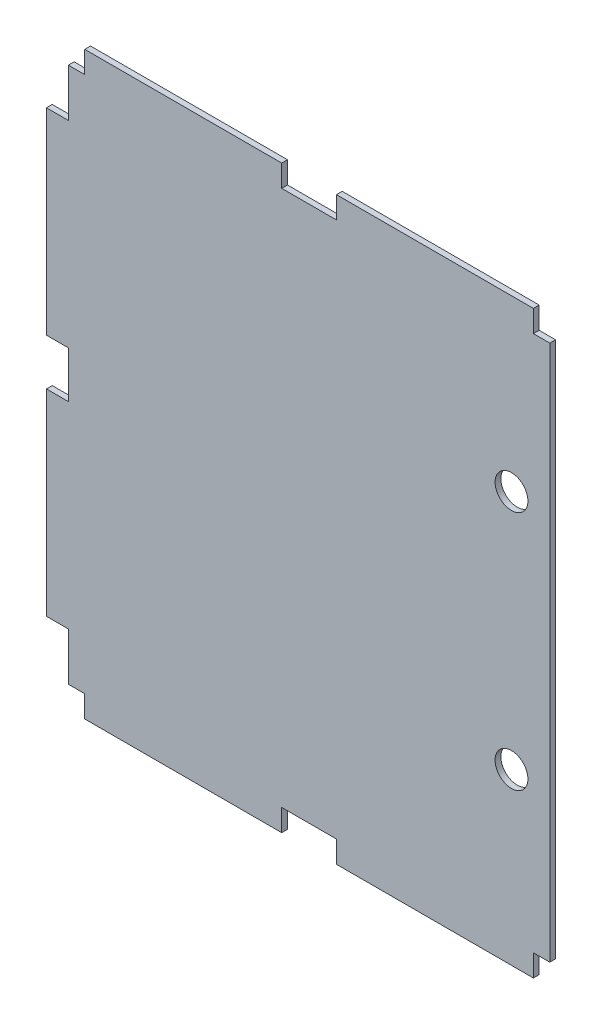
ISO-10303-21;
HEADER;
FILE_DESCRIPTION(('STEP AP214'),'2;1');
FILE_NAME('part.step','',(''),(''),'','','');
FILE_SCHEMA(('AUTOMOTIVE_DESIGN { 1 0 10303 214 1 1 1 1 }'));
ENDSEC;
DATA;
#1=APPLICATION_CONTEXT('core data for automotive mechanical design processes');
#2=APPLICATION_PROTOCOL_DEFINITION('international standard','automotive_design',2000,#1);
#3=PRODUCT_CONTEXT('',#1,'mechanical');
#4=PRODUCT('Part','Part','',(#3));
#5=PRODUCT_RELATED_PRODUCT_CATEGORY('part','',(#4));
#6=PRODUCT_DEFINITION_FORMATION('','',#4);
#7=PRODUCT_DEFINITION_CONTEXT('part definition',#1,'design');
#8=PRODUCT_DEFINITION('design','',#6,#7);
#9=PRODUCT_DEFINITION_SHAPE('','',#8);
#10=(LENGTH_UNIT() NAMED_UNIT(*) SI_UNIT(.MILLI.,.METRE.));
#11=(NAMED_UNIT(*) PLANE_ANGLE_UNIT() SI_UNIT($,.RADIAN.));
#12=(NAMED_UNIT(*) SI_UNIT($,.STERADIAN.) SOLID_ANGLE_UNIT());
#13=UNCERTAINTY_MEASURE_WITH_UNIT(LENGTH_MEASURE(1.E-05),#10,'distance_accuracy_value','');
#14=(GEOMETRIC_REPRESENTATION_CONTEXT(3) GLOBAL_UNCERTAINTY_ASSIGNED_CONTEXT((#13)) GLOBAL_UNIT_ASSIGNED_CONTEXT((#10,
#11,#12)) REPRESENTATION_CONTEXT('',''));
#15=CARTESIAN_POINT('',(0.,0.,0.));
#16=DIRECTION('',(0.,0.,1.));
#17=DIRECTION('',(1.,0.,0.));
#18=AXIS2_PLACEMENT_3D('',#15,#16,#17);
#19=CARTESIAN_POINT('',(0.,0.,0.));
#20=DIRECTION('',(0.,0.,1.));
#21=DIRECTION('',(1.,0.,0.));
#22=AXIS2_PLACEMENT_3D('',#19,#20,#21);
#23=PLANE('',#22);
#24=DIRECTION('',(1.,0.,0.));
#25=VECTOR('',#24,1.);
#26=CARTESIAN_POINT('',(0.,-155.575,0.));
#27=LINE('',#26,#25);
#28=CARTESIAN_POINT('',(-139.7,-155.575,0.));
#29=VERTEX_POINT('',#28);
#30=CARTESIAN_POINT('',(-130.175,-155.575,0.));
#31=VERTEX_POINT('',#30);
#32=EDGE_CURVE('E135',#29,#31,#27,.T.);
#33=ORIENTED_EDGE('',*,*,#32,.F.);
#34=DIRECTION('',(0.,1.,0.));
#35=VECTOR('',#34,1.);
#36=CARTESIAN_POINT('',(-139.7,0.,0.));
#37=LINE('',#36,#35);
#38=CARTESIAN_POINT('',(-139.7,-127.79375,0.));
#39=VERTEX_POINT('',#38);
#40=EDGE_CURVE('E296',#29,#39,#37,.T.);
#41=ORIENTED_EDGE('',*,*,#40,.T.);
#42=DIRECTION('',(-1.,0.,0.));
#43=VECTOR('',#42,1.);
#44=CARTESIAN_POINT('',(2.79290479632265E-13,-127.79375,0.));
#45=LINE('',#44,#43);
#46=CARTESIAN_POINT('',(-152.4,-127.79375,0.));
#47=VERTEX_POINT('',#46);
#48=EDGE_CURVE('E346',#39,#47,#45,.T.);
#49=ORIENTED_EDGE('',*,*,#48,.T.);
#50=DIRECTION('',(0.,-1.,0.));
#51=VECTOR('',#50,1.);
#52=CARTESIAN_POINT('',(-152.4,0.,0.));
#53=LINE('',#52,#51);
#54=CARTESIAN_POINT('',(-152.4,-13.49375,0.));
#55=VERTEX_POINT('',#54);
#56=EDGE_CURVE('E353',#55,#47,#53,.T.);
#57=ORIENTED_EDGE('',*,*,#56,.F.);
#58=DIRECTION('',(-1.,0.,0.));
#59=VECTOR('',#58,1.);
#60=CARTESIAN_POINT('',(0.,-13.49375,0.));
#61=LINE('',#60,#59);
#62=CARTESIAN_POINT('',(-139.7,-13.49375,0.));
#63=VERTEX_POINT('',#62);
#64=EDGE_CURVE('E348',#63,#55,#61,.T.);
#65=ORIENTED_EDGE('',*,*,#64,.F.);
#66=CARTESIAN_POINT('',(-139.7,13.49375,0.));
#67=VERTEX_POINT('',#66);
#68=EDGE_CURVE('E340',#63,#67,#37,.T.);
#69=ORIENTED_EDGE('',*,*,#68,.T.);
#70=DIRECTION('',(-1.,0.,0.));
#71=VECTOR('',#70,1.);
#72=CARTESIAN_POINT('',(0.,13.49375,0.));
#73=LINE('',#72,#71);
#74=CARTESIAN_POINT('',(-152.4,13.49375,0.));
#75=VERTEX_POINT('',#74);
#76=EDGE_CURVE('E349',#67,#75,#73,.T.);
#77=ORIENTED_EDGE('',*,*,#76,.T.);
#78=DIRECTION('',(0.,-1.,0.));
#79=VECTOR('',#78,1.);
#80=CARTESIAN_POINT('',(-152.4,0.,0.));
#81=LINE('',#80,#79);
#82=CARTESIAN_POINT('',(-152.4,127.79375,0.));
#83=VERTEX_POINT('',#82);
#84=EDGE_CURVE('E343',#83,#75,#81,.T.);
#85=ORIENTED_EDGE('',*,*,#84,.F.);
#86=DIRECTION('',(-1.,0.,0.));
#87=VECTOR('',#86,1.);
#88=CARTESIAN_POINT('',(0.,127.79375,0.));
#89=LINE('',#88,#87);
#90=CARTESIAN_POINT('',(-139.7,127.79375,0.));
#91=VERTEX_POINT('',#90);
#92=EDGE_CURVE('E339',#91,#83,#89,.T.);
#93=ORIENTED_EDGE('',*,*,#92,.F.);
#94=CARTESIAN_POINT('',(-139.7,155.575,0.));
#95=VERTEX_POINT('',#94);
#96=EDGE_CURVE('E336',#91,#95,#37,.T.);
#97=ORIENTED_EDGE('',*,*,#96,.T.);
#98=DIRECTION('',(1.,0.,0.));
#99=VECTOR('',#98,1.);
#100=CARTESIAN_POINT('',(0.,155.575,0.));
#101=LINE('',#100,#99);
#102=CARTESIAN_POINT('',(-130.175,155.575,0.));
#103=VERTEX_POINT('',#102);
#104=EDGE_CURVE('E332',#95,#103,#101,.T.);
#105=ORIENTED_EDGE('',*,*,#104,.T.);
#106=DIRECTION('',(0.,1.,0.));
#107=VECTOR('',#106,1.);
#108=CARTESIAN_POINT('',(-130.175,155.575,0.));
#109=LINE('',#108,#107);
#110=CARTESIAN_POINT('',(-130.175,168.275,0.));
#111=VERTEX_POINT('',#110);
#112=EDGE_CURVE('E113',#103,#111,#109,.T.);
#113=ORIENTED_EDGE('',*,*,#112,.T.);
#114=DIRECTION('',(1.,0.,0.));
#115=VECTOR('',#114,1.);
#116=CARTESIAN_POINT('',(-130.175,168.275,0.));
#117=LINE('',#116,#115);
#118=CARTESIAN_POINT('',(-15.875,168.275,0.));
#119=VERTEX_POINT('',#118);
#120=EDGE_CURVE('E91',#111,#119,#117,.T.);
#121=ORIENTED_EDGE('',*,*,#120,.T.);
#122=DIRECTION('',(0.,1.,0.));
#123=VECTOR('',#122,1.);
#124=CARTESIAN_POINT('',(-15.875,155.575,0.));
#125=LINE('',#124,#123);
#126=CARTESIAN_POINT('',(-15.875,155.575,0.));
#127=VERTEX_POINT('',#126);
#128=EDGE_CURVE('E100',#127,#119,#125,.T.);
#129=ORIENTED_EDGE('',*,*,#128,.F.);
#130=CARTESIAN_POINT('',(15.8750000000002,155.575,0.));
#131=VERTEX_POINT('',#130);
#132=EDGE_CURVE('E329',#127,#131,#101,.T.);
#133=ORIENTED_EDGE('',*,*,#132,.T.);
#134=DIRECTION('',(0.,1.,0.));
#135=VECTOR('',#134,1.);
#136=CARTESIAN_POINT('',(15.8750000000002,155.575,0.));
#137=LINE('',#136,#135);
#138=CARTESIAN_POINT('',(15.8750000000002,168.275,0.));
#139=VERTEX_POINT('',#138);
#140=EDGE_CURVE('E97',#131,#139,#137,.T.);
#141=ORIENTED_EDGE('',*,*,#140,.T.);
#142=DIRECTION('',(1.,0.,0.));
#143=VECTOR('',#142,1.);
#144=CARTESIAN_POINT('',(15.8750000000002,168.275,0.));
#145=LINE('',#144,#143);
#146=CARTESIAN_POINT('',(130.175,168.275,0.));
#147=VERTEX_POINT('',#146);
#148=EDGE_CURVE('E314',#139,#147,#145,.T.);
#149=ORIENTED_EDGE('',*,*,#148,.T.);
#150=DIRECTION('',(0.,1.,0.));
#151=VECTOR('',#150,1.);
#152=CARTESIAN_POINT('',(130.175,155.575,0.));
#153=LINE('',#152,#151);
#154=CARTESIAN_POINT('',(130.175,155.575,0.));
#155=VERTEX_POINT('',#154);
#156=EDGE_CURVE('E130',#155,#147,#153,.T.);
#157=ORIENTED_EDGE('',*,*,#156,.F.);
#158=CARTESIAN_POINT('',(139.7,155.575,0.));
#159=VERTEX_POINT('',#158);
#160=EDGE_CURVE('E323',#155,#159,#101,.T.);
#161=ORIENTED_EDGE('',*,*,#160,.T.);
#162=DIRECTION('',(0.,1.,0.));
#163=VECTOR('',#162,1.);
#164=CARTESIAN_POINT('',(139.7,0.,0.));
#165=LINE('',#164,#163);
#166=CARTESIAN_POINT('',(139.7,-155.575,0.));
#167=VERTEX_POINT('',#166);
#168=EDGE_CURVE('E330',#167,#159,#165,.T.);
#169=ORIENTED_EDGE('',*,*,#168,.F.);
#170=CARTESIAN_POINT('',(130.175,-155.575,0.));
#171=VERTEX_POINT('',#170);
#172=EDGE_CURVE('E333',#171,#167,#27,.T.);
#173=ORIENTED_EDGE('',*,*,#172,.F.);
#174=DIRECTION('',(0.,-1.,0.));
#175=VECTOR('',#174,1.);
#176=CARTESIAN_POINT('',(130.175,0.,0.));
#177=LINE('',#176,#175);
#178=CARTESIAN_POINT('',(130.175,-168.275,0.));
#179=VERTEX_POINT('',#178);
#180=EDGE_CURVE('E429',#171,#179,#177,.T.);
#181=ORIENTED_EDGE('',*,*,#180,.T.);
#182=DIRECTION('',(-1.,0.,0.));
#183=VECTOR('',#182,1.);
#184=CARTESIAN_POINT('',(0.,-168.275,0.));
#185=LINE('',#184,#183);
#186=CARTESIAN_POINT('',(15.8750000000005,-168.275,0.));
#187=VERTEX_POINT('',#186);
#188=EDGE_CURVE('E426',#179,#187,#185,.T.);
#189=ORIENTED_EDGE('',*,*,#188,.T.);
#190=DIRECTION('',(0.,-1.,0.));
#191=VECTOR('',#190,1.);
#192=CARTESIAN_POINT('',(15.8750000000005,0.,0.));
#193=LINE('',#192,#191);
#194=CARTESIAN_POINT('',(15.8750000000005,-155.575,0.));
#195=VERTEX_POINT('',#194);
#196=EDGE_CURVE('E420',#195,#187,#193,.T.);
#197=ORIENTED_EDGE('',*,*,#196,.F.);
#198=CARTESIAN_POINT('',(-15.875,-155.575,0.));
#199=VERTEX_POINT('',#198);
#200=EDGE_CURVE('E418',#199,#195,#27,.T.);
#201=ORIENTED_EDGE('',*,*,#200,.F.);
#202=DIRECTION('',(0.,-1.,0.));
#203=VECTOR('',#202,1.);
#204=CARTESIAN_POINT('',(-15.875,0.,0.));
#205=LINE('',#204,#203);
#206=CARTESIAN_POINT('',(-15.875,-168.275,0.));
#207=VERTEX_POINT('',#206);
#208=EDGE_CURVE('E407',#199,#207,#205,.T.);
#209=ORIENTED_EDGE('',*,*,#208,.T.);
#210=DIRECTION('',(-1.,0.,0.));
#211=VECTOR('',#210,1.);
#212=CARTESIAN_POINT('',(0.,-168.275,0.));
#213=LINE('',#212,#211);
#214=CARTESIAN_POINT('',(-130.175,-168.275,0.));
#215=VERTEX_POINT('',#214);
#216=EDGE_CURVE('E412',#207,#215,#213,.T.);
#217=ORIENTED_EDGE('',*,*,#216,.T.);
#218=DIRECTION('',(0.,-1.,0.));
#219=VECTOR('',#218,1.);
#220=CARTESIAN_POINT('',(-130.175,0.,0.));
#221=LINE('',#220,#219);
#222=EDGE_CURVE('E414',#31,#215,#221,.T.);
#223=ORIENTED_EDGE('',*,*,#222,.F.);
#224=EDGE_LOOP('',(#33,#41,#49,#57,#65,#69,#77,#85,#93,#97,#105,#113,#121,#129,#133,#141,#149,
#157,#161,#169,#173,#181,#189,#197,#201,#209,#217,#223));
#225=FACE_BOUND('',#224,.T.);
#226=CARTESIAN_POINT('',(117.475,-69.85,0.));
#227=DIRECTION('',(0.,0.,1.));
#228=DIRECTION('',(1.,0.,0.));
#229=AXIS2_PLACEMENT_3D('',#226,#227,#228);
#230=CIRCLE('',#229,9.52499999999998);
#231=CARTESIAN_POINT('',(127.,-69.85,0.));
#232=VERTEX_POINT('',#231);
#233=EDGE_CURVE('E722',#232,#232,#230,.F.);
#234=ORIENTED_EDGE('',*,*,#233,.F.);
#235=EDGE_LOOP('',(#234));
#236=FACE_BOUND('',#235,.T.);
#237=CARTESIAN_POINT('',(117.475,69.85,0.));
#238=DIRECTION('',(0.,0.,1.));
#239=DIRECTION('',(1.,0.,0.));
#240=AXIS2_PLACEMENT_3D('',#237,#238,#239);
#241=CIRCLE('',#240,9.52499999999998);
#242=CARTESIAN_POINT('',(127.,69.85,0.));
#243=VERTEX_POINT('',#242);
#244=EDGE_CURVE('E115',#243,#243,#241,.T.);
#245=ORIENTED_EDGE('',*,*,#244,.T.);
#246=EDGE_LOOP('',(#245));
#247=FACE_BOUND('',#246,.T.);
#248=ADVANCED_FACE('F35',(#225,#236,#247),#23,.F.);
#249=CARTESIAN_POINT('',(0.,0.,3.3528));
#250=DIRECTION('',(0.,0.,1.));
#251=DIRECTION('',(1.,0.,0.));
#252=AXIS2_PLACEMENT_3D('',#249,#250,#251);
#253=PLANE('',#252);
#254=CARTESIAN_POINT('',(117.475,-69.85,3.3528));
#255=DIRECTION('',(0.,0.,1.));
#256=DIRECTION('',(1.,0.,0.));
#257=AXIS2_PLACEMENT_3D('',#254,#255,#256);
#258=CIRCLE('',#257,9.52499999999998);
#259=CARTESIAN_POINT('',(127.,-69.85,3.3528));
#260=VERTEX_POINT('',#259);
#261=EDGE_CURVE('E762',#260,#260,#258,.F.);
#262=ORIENTED_EDGE('',*,*,#261,.T.);
#263=EDGE_LOOP('',(#262));
#264=FACE_BOUND('',#263,.T.);
#265=DIRECTION('',(1.,0.,0.));
#266=VECTOR('',#265,1.);
#267=CARTESIAN_POINT('',(0.,-155.575,3.3528));
#268=LINE('',#267,#266);
#269=CARTESIAN_POINT('',(-139.7,-155.575,3.3528));
#270=VERTEX_POINT('',#269);
#271=CARTESIAN_POINT('',(-130.175,-155.575,3.3528));
#272=VERTEX_POINT('',#271);
#273=EDGE_CURVE('E288',#270,#272,#268,.T.);
#274=ORIENTED_EDGE('',*,*,#273,.T.);
#275=DIRECTION('',(0.,-1.,0.));
#276=VECTOR('',#275,1.);
#277=CARTESIAN_POINT('',(-130.175,0.,3.3528));
#278=LINE('',#277,#276);
#279=CARTESIAN_POINT('',(-130.175,-168.275,3.3528));
#280=VERTEX_POINT('',#279);
#281=EDGE_CURVE('E279',#272,#280,#278,.T.);
#282=ORIENTED_EDGE('',*,*,#281,.T.);
#283=DIRECTION('',(-1.,0.,0.));
#284=VECTOR('',#283,1.);
#285=CARTESIAN_POINT('',(0.,-168.275,3.3528));
#286=LINE('',#285,#284);
#287=CARTESIAN_POINT('',(-15.875,-168.275,3.3528));
#288=VERTEX_POINT('',#287);
#289=EDGE_CURVE('E287',#288,#280,#286,.T.);
#290=ORIENTED_EDGE('',*,*,#289,.F.);
#291=DIRECTION('',(0.,-1.,0.));
#292=VECTOR('',#291,1.);
#293=CARTESIAN_POINT('',(-15.875,0.,3.3528));
#294=LINE('',#293,#292);
#295=CARTESIAN_POINT('',(-15.875,-155.575,3.3528));
#296=VERTEX_POINT('',#295);
#297=EDGE_CURVE('E409',#296,#288,#294,.T.);
#298=ORIENTED_EDGE('',*,*,#297,.F.);
#299=CARTESIAN_POINT('',(15.8750000000005,-155.575,3.3528));
#300=VERTEX_POINT('',#299);
#301=EDGE_CURVE('E299',#296,#300,#268,.T.);
#302=ORIENTED_EDGE('',*,*,#301,.T.);
#303=DIRECTION('',(0.,-1.,0.));
#304=VECTOR('',#303,1.);
#305=CARTESIAN_POINT('',(15.8750000000005,0.,3.3528));
#306=LINE('',#305,#304);
#307=CARTESIAN_POINT('',(15.8750000000005,-168.275,3.3528));
#308=VERTEX_POINT('',#307);
#309=EDGE_CURVE('E730',#300,#308,#306,.T.);
#310=ORIENTED_EDGE('',*,*,#309,.T.);
#311=DIRECTION('',(-1.,0.,0.));
#312=VECTOR('',#311,1.);
#313=CARTESIAN_POINT('',(0.,-168.275,3.3528));
#314=LINE('',#313,#312);
#315=CARTESIAN_POINT('',(130.175,-168.275,3.3528));
#316=VERTEX_POINT('',#315);
#317=EDGE_CURVE('E732',#316,#308,#314,.T.);
#318=ORIENTED_EDGE('',*,*,#317,.F.);
#319=DIRECTION('',(0.,-1.,0.));
#320=VECTOR('',#319,1.);
#321=CARTESIAN_POINT('',(130.175,0.,3.3528));
#322=LINE('',#321,#320);
#323=CARTESIAN_POINT('',(130.175,-155.575,3.3528));
#324=VERTEX_POINT('',#323);
#325=EDGE_CURVE('E735',#324,#316,#322,.T.);
#326=ORIENTED_EDGE('',*,*,#325,.F.);
#327=CARTESIAN_POINT('',(139.7,-155.575,3.3528));
#328=VERTEX_POINT('',#327);
#329=EDGE_CURVE('E298',#324,#328,#268,.T.);
#330=ORIENTED_EDGE('',*,*,#329,.T.);
#331=DIRECTION('',(0.,1.,0.));
#332=VECTOR('',#331,1.);
#333=CARTESIAN_POINT('',(139.7,0.,3.3528));
#334=LINE('',#333,#332);
#335=CARTESIAN_POINT('',(139.7,155.575,3.3528));
#336=VERTEX_POINT('',#335);
#337=EDGE_CURVE('E738',#328,#336,#334,.T.);
#338=ORIENTED_EDGE('',*,*,#337,.T.);
#339=DIRECTION('',(1.,0.,0.));
#340=VECTOR('',#339,1.);
#341=CARTESIAN_POINT('',(0.,155.575,3.3528));
#342=LINE('',#341,#340);
#343=CARTESIAN_POINT('',(130.175,155.575,3.3528));
#344=VERTEX_POINT('',#343);
#345=EDGE_CURVE('E741',#344,#336,#342,.T.);
#346=ORIENTED_EDGE('',*,*,#345,.F.);
#347=DIRECTION('',(0.,1.,0.));
#348=VECTOR('',#347,1.);
#349=CARTESIAN_POINT('',(130.175,155.575,3.3528));
#350=LINE('',#349,#348);
#351=CARTESIAN_POINT('',(130.175,168.275,3.3528));
#352=VERTEX_POINT('',#351);
#353=EDGE_CURVE('E138',#344,#352,#350,.T.);
#354=ORIENTED_EDGE('',*,*,#353,.T.);
#355=DIRECTION('',(1.,0.,0.));
#356=VECTOR('',#355,1.);
#357=CARTESIAN_POINT('',(15.8750000000002,168.275,3.3528));
#358=LINE('',#357,#356);
#359=CARTESIAN_POINT('',(15.8750000000002,168.275,3.3528));
#360=VERTEX_POINT('',#359);
#361=EDGE_CURVE('E309',#360,#352,#358,.T.);
#362=ORIENTED_EDGE('',*,*,#361,.F.);
#363=DIRECTION('',(0.,1.,0.));
#364=VECTOR('',#363,1.);
#365=CARTESIAN_POINT('',(15.8750000000002,155.575,3.3528));
#366=LINE('',#365,#364);
#367=CARTESIAN_POINT('',(15.8750000000002,155.575,3.3528));
#368=VERTEX_POINT('',#367);
#369=EDGE_CURVE('E306',#368,#360,#366,.T.);
#370=ORIENTED_EDGE('',*,*,#369,.F.);
#371=CARTESIAN_POINT('',(-15.875,155.575,3.3528));
#372=VERTEX_POINT('',#371);
#373=EDGE_CURVE('E148',#372,#368,#342,.T.);
#374=ORIENTED_EDGE('',*,*,#373,.F.);
#375=DIRECTION('',(0.,1.,0.));
#376=VECTOR('',#375,1.);
#377=CARTESIAN_POINT('',(-15.875,155.575,3.3528));
#378=LINE('',#377,#376);
#379=CARTESIAN_POINT('',(-15.875,168.275,3.3528));
#380=VERTEX_POINT('',#379);
#381=EDGE_CURVE('E140',#372,#380,#378,.T.);
#382=ORIENTED_EDGE('',*,*,#381,.T.);
#383=DIRECTION('',(1.,0.,0.));
#384=VECTOR('',#383,1.);
#385=CARTESIAN_POINT('',(-130.175,168.275,3.3528));
#386=LINE('',#385,#384);
#387=CARTESIAN_POINT('',(-130.175,168.275,3.3528));
#388=VERTEX_POINT('',#387);
#389=EDGE_CURVE('E94',#388,#380,#386,.T.);
#390=ORIENTED_EDGE('',*,*,#389,.F.);
#391=DIRECTION('',(0.,1.,0.));
#392=VECTOR('',#391,1.);
#393=CARTESIAN_POINT('',(-130.175,155.575,3.3528));
#394=LINE('',#393,#392);
#395=CARTESIAN_POINT('',(-130.175,155.575,3.3528));
#396=VERTEX_POINT('',#395);
#397=EDGE_CURVE('E108',#396,#388,#394,.T.);
#398=ORIENTED_EDGE('',*,*,#397,.F.);
#399=CARTESIAN_POINT('',(-139.7,155.575,3.3528));
#400=VERTEX_POINT('',#399);
#401=EDGE_CURVE('E480',#400,#396,#342,.T.);
#402=ORIENTED_EDGE('',*,*,#401,.F.);
#403=DIRECTION('',(0.,1.,0.));
#404=VECTOR('',#403,1.);
#405=CARTESIAN_POINT('',(-139.7,0.,3.3528));
#406=LINE('',#405,#404);
#407=CARTESIAN_POINT('',(-139.7,127.79375,3.3528));
#408=VERTEX_POINT('',#407);
#409=EDGE_CURVE('E475',#408,#400,#406,.T.);
#410=ORIENTED_EDGE('',*,*,#409,.F.);
#411=DIRECTION('',(-1.,0.,0.));
#412=VECTOR('',#411,1.);
#413=CARTESIAN_POINT('',(0.,127.79375,3.3528));
#414=LINE('',#413,#412);
#415=CARTESIAN_POINT('',(-152.4,127.79375,3.3528));
#416=VERTEX_POINT('',#415);
#417=EDGE_CURVE('E744',#408,#416,#414,.T.);
#418=ORIENTED_EDGE('',*,*,#417,.T.);
#419=DIRECTION('',(0.,-1.,0.));
#420=VECTOR('',#419,1.);
#421=CARTESIAN_POINT('',(-152.4,0.,3.3528));
#422=LINE('',#421,#420);
#423=CARTESIAN_POINT('',(-152.4,13.49375,3.3528));
#424=VERTEX_POINT('',#423);
#425=EDGE_CURVE('E746',#416,#424,#422,.T.);
#426=ORIENTED_EDGE('',*,*,#425,.T.);
#427=DIRECTION('',(-1.,0.,0.));
#428=VECTOR('',#427,1.);
#429=CARTESIAN_POINT('',(0.,13.49375,3.3528));
#430=LINE('',#429,#428);
#431=CARTESIAN_POINT('',(-139.7,13.49375,3.3528));
#432=VERTEX_POINT('',#431);
#433=EDGE_CURVE('E464',#432,#424,#430,.T.);
#434=ORIENTED_EDGE('',*,*,#433,.F.);
#435=CARTESIAN_POINT('',(-139.7,-13.49375,3.3528));
#436=VERTEX_POINT('',#435);
#437=EDGE_CURVE('E458',#436,#432,#406,.T.);
#438=ORIENTED_EDGE('',*,*,#437,.F.);
#439=DIRECTION('',(-1.,0.,0.));
#440=VECTOR('',#439,1.);
#441=CARTESIAN_POINT('',(0.,-13.49375,3.3528));
#442=LINE('',#441,#440);
#443=CARTESIAN_POINT('',(-152.4,-13.49375,3.3528));
#444=VERTEX_POINT('',#443);
#445=EDGE_CURVE('E453',#436,#444,#442,.T.);
#446=ORIENTED_EDGE('',*,*,#445,.T.);
#447=DIRECTION('',(0.,-1.,0.));
#448=VECTOR('',#447,1.);
#449=CARTESIAN_POINT('',(-152.4,0.,3.3528));
#450=LINE('',#449,#448);
#451=CARTESIAN_POINT('',(-152.4,-127.79375,3.3528));
#452=VERTEX_POINT('',#451);
#453=EDGE_CURVE('E449',#444,#452,#450,.T.);
#454=ORIENTED_EDGE('',*,*,#453,.T.);
#455=DIRECTION('',(-1.,0.,0.));
#456=VECTOR('',#455,1.);
#457=CARTESIAN_POINT('',(2.79290479632265E-13,-127.79375,3.3528));
#458=LINE('',#457,#456);
#459=CARTESIAN_POINT('',(-139.7,-127.79375,3.3528));
#460=VERTEX_POINT('',#459);
#461=EDGE_CURVE('E750',#460,#452,#458,.T.);
#462=ORIENTED_EDGE('',*,*,#461,.F.);
#463=EDGE_CURVE('E294',#270,#460,#406,.T.);
#464=ORIENTED_EDGE('',*,*,#463,.F.);
#465=EDGE_LOOP('',(#274,#282,#290,#298,#302,#310,#318,#326,#330,#338,#346,#354,#362,#370,#374,
#382,#390,#398,#402,#410,#418,#426,#434,#438,#446,#454,#462,#464));
#466=FACE_BOUND('',#465,.T.);
#467=CARTESIAN_POINT('',(117.475,69.85,3.3528));
#468=DIRECTION('',(0.,0.,1.));
#469=DIRECTION('',(1.,0.,0.));
#470=AXIS2_PLACEMENT_3D('',#467,#468,#469);
#471=CIRCLE('',#470,9.52499999999998);
#472=CARTESIAN_POINT('',(127.,69.85,3.3528));
#473=VERTEX_POINT('',#472);
#474=EDGE_CURVE('E718',#473,#473,#471,.T.);
#475=ORIENTED_EDGE('',*,*,#474,.F.);
#476=EDGE_LOOP('',(#475));
#477=FACE_BOUND('',#476,.T.);
#478=ADVANCED_FACE('F144',(#264,#466,#477),#253,.T.);
#479=CARTESIAN_POINT('',(-139.7,0.,3.3528));
#480=DIRECTION('',(-1.,0.,0.));
#481=DIRECTION('',(0.,-1.,0.));
#482=AXIS2_PLACEMENT_3D('',#479,#480,#481);
#483=PLANE('',#482);
#484=ORIENTED_EDGE('',*,*,#40,.F.);
#485=DIRECTION('',(0.,0.,-1.));
#486=VECTOR('',#485,1.);
#487=CARTESIAN_POINT('',(-139.7,-155.575,3.3528));
#488=LINE('',#487,#486);
#489=EDGE_CURVE('E365',#270,#29,#488,.T.);
#490=ORIENTED_EDGE('',*,*,#489,.F.);
#491=ORIENTED_EDGE('',*,*,#463,.T.);
#492=DIRECTION('',(0.,0.,-1.));
#493=VECTOR('',#492,1.);
#494=CARTESIAN_POINT('',(-139.7,-127.79375,3.3528));
#495=LINE('',#494,#493);
#496=EDGE_CURVE('E367',#460,#39,#495,.T.);
#497=ORIENTED_EDGE('',*,*,#496,.T.);
#498=EDGE_LOOP('',(#484,#490,#491,#497));
#499=FACE_BOUND('',#498,.T.);
#500=ADVANCED_FACE('F438',(#499),#483,.T.);
#501=CARTESIAN_POINT('',(2.79290479632265E-13,-127.79375,3.3528));
#502=DIRECTION('',(0.,-1.,0.));
#503=DIRECTION('',(1.,0.,0.));
#504=AXIS2_PLACEMENT_3D('',#501,#502,#503);
#505=PLANE('',#504);
#506=ORIENTED_EDGE('',*,*,#48,.F.);
#507=ORIENTED_EDGE('',*,*,#496,.F.);
#508=ORIENTED_EDGE('',*,*,#461,.T.);
#509=DIRECTION('',(0.,0.,-1.));
#510=VECTOR('',#509,1.);
#511=CARTESIAN_POINT('',(-152.4,-127.79375,3.3528));
#512=LINE('',#511,#510);
#513=EDGE_CURVE('E369',#452,#47,#512,.T.);
#514=ORIENTED_EDGE('',*,*,#513,.T.);
#515=EDGE_LOOP('',(#506,#507,#508,#514));
#516=FACE_BOUND('',#515,.T.);
#517=ADVANCED_FACE('F442',(#516),#505,.T.);
#518=CARTESIAN_POINT('',(-152.4,0.,3.3528));
#519=DIRECTION('',(1.,0.,0.));
#520=DIRECTION('',(0.,1.,0.));
#521=AXIS2_PLACEMENT_3D('',#518,#519,#520);
#522=PLANE('',#521);
#523=ORIENTED_EDGE('',*,*,#56,.T.);
#524=ORIENTED_EDGE('',*,*,#513,.F.);
#525=ORIENTED_EDGE('',*,*,#453,.F.);
#526=DIRECTION('',(0.,0.,-1.));
#527=VECTOR('',#526,1.);
#528=CARTESIAN_POINT('',(-152.4,-13.49375,3.3528));
#529=LINE('',#528,#527);
#530=EDGE_CURVE('E371',#444,#55,#529,.T.);
#531=ORIENTED_EDGE('',*,*,#530,.T.);
#532=EDGE_LOOP('',(#523,#524,#525,#531));
#533=FACE_BOUND('',#532,.T.);
#534=ADVANCED_FACE('F446',(#533),#522,.F.);
#535=CARTESIAN_POINT('',(0.,-13.49375,3.3528));
#536=DIRECTION('',(0.,-1.,0.));
#537=DIRECTION('',(0.,0.,-1.));
#538=AXIS2_PLACEMENT_3D('',#535,#536,#537);
#539=PLANE('',#538);
#540=ORIENTED_EDGE('',*,*,#64,.T.);
#541=ORIENTED_EDGE('',*,*,#530,.F.);
#542=ORIENTED_EDGE('',*,*,#445,.F.);
#543=DIRECTION('',(0.,0.,-1.));
#544=VECTOR('',#543,1.);
#545=CARTESIAN_POINT('',(-139.7,-13.49375,3.3528));
#546=LINE('',#545,#544);
#547=EDGE_CURVE('E374',#436,#63,#546,.T.);
#548=ORIENTED_EDGE('',*,*,#547,.T.);
#549=EDGE_LOOP('',(#540,#541,#542,#548));
#550=FACE_BOUND('',#549,.T.);
#551=ADVANCED_FACE('F452',(#550),#539,.F.);
#552=ORIENTED_EDGE('',*,*,#68,.F.);
#553=ORIENTED_EDGE('',*,*,#547,.F.);
#554=ORIENTED_EDGE('',*,*,#437,.T.);
#555=DIRECTION('',(0.,0.,-1.));
#556=VECTOR('',#555,1.);
#557=CARTESIAN_POINT('',(-139.7,13.49375,3.3528));
#558=LINE('',#557,#556);
#559=EDGE_CURVE('E376',#432,#67,#558,.T.);
#560=ORIENTED_EDGE('',*,*,#559,.T.);
#561=EDGE_LOOP('',(#552,#553,#554,#560));
#562=FACE_BOUND('',#561,.T.);
#563=ADVANCED_FACE('F457',(#562),#483,.T.);
#564=CARTESIAN_POINT('',(0.,13.49375,3.3528));
#565=DIRECTION('',(0.,-1.,0.));
#566=DIRECTION('',(0.,0.,-1.));
#567=AXIS2_PLACEMENT_3D('',#564,#565,#566);
#568=PLANE('',#567);
#569=ORIENTED_EDGE('',*,*,#76,.F.);
#570=ORIENTED_EDGE('',*,*,#559,.F.);
#571=ORIENTED_EDGE('',*,*,#433,.T.);
#572=DIRECTION('',(0.,0.,-1.));
#573=VECTOR('',#572,1.);
#574=CARTESIAN_POINT('',(-152.4,13.49375,3.3528));
#575=LINE('',#574,#573);
#576=EDGE_CURVE('E378',#424,#75,#575,.T.);
#577=ORIENTED_EDGE('',*,*,#576,.T.);
#578=EDGE_LOOP('',(#569,#570,#571,#577));
#579=FACE_BOUND('',#578,.T.);
#580=ADVANCED_FACE('F462',(#579),#568,.T.);
#581=CARTESIAN_POINT('',(-152.4,0.,3.3528));
#582=DIRECTION('',(1.,0.,0.));
#583=DIRECTION('',(0.,1.,0.));
#584=AXIS2_PLACEMENT_3D('',#581,#582,#583);
#585=PLANE('',#584);
#586=ORIENTED_EDGE('',*,*,#84,.T.);
#587=ORIENTED_EDGE('',*,*,#576,.F.);
#588=ORIENTED_EDGE('',*,*,#425,.F.);
#589=DIRECTION('',(0.,0.,-1.));
#590=VECTOR('',#589,1.);
#591=CARTESIAN_POINT('',(-152.4,127.79375,3.3528));
#592=LINE('',#591,#590);
#593=EDGE_CURVE('E380',#416,#83,#592,.T.);
#594=ORIENTED_EDGE('',*,*,#593,.T.);
#595=EDGE_LOOP('',(#586,#587,#588,#594));
#596=FACE_BOUND('',#595,.T.);
#597=ADVANCED_FACE('F467',(#596),#585,.F.);
#598=CARTESIAN_POINT('',(0.,127.79375,3.3528));
#599=DIRECTION('',(0.,-1.,0.));
#600=DIRECTION('',(0.,0.,-1.));
#601=AXIS2_PLACEMENT_3D('',#598,#599,#600);
#602=PLANE('',#601);
#603=ORIENTED_EDGE('',*,*,#92,.T.);
#604=ORIENTED_EDGE('',*,*,#593,.F.);
#605=ORIENTED_EDGE('',*,*,#417,.F.);
#606=DIRECTION('',(0.,0.,-1.));
#607=VECTOR('',#606,1.);
#608=CARTESIAN_POINT('',(-139.7,127.79375,3.3528));
#609=LINE('',#608,#607);
#610=EDGE_CURVE('E383',#408,#91,#609,.T.);
#611=ORIENTED_EDGE('',*,*,#610,.T.);
#612=EDGE_LOOP('',(#603,#604,#605,#611));
#613=FACE_BOUND('',#612,.T.);
#614=ADVANCED_FACE('F513',(#613),#602,.F.);
#615=CARTESIAN_POINT('',(0.,-155.575,3.3528));
#616=DIRECTION('',(0.,1.,0.));
#617=DIRECTION('',(0.,0.,1.));
#618=AXIS2_PLACEMENT_3D('',#615,#616,#617);
#619=PLANE('',#618);
#620=ORIENTED_EDGE('',*,*,#172,.T.);
#621=DIRECTION('',(0.,0.,-1.));
#622=VECTOR('',#621,1.);
#623=CARTESIAN_POINT('',(139.7,-155.575,3.3528));
#624=LINE('',#623,#622);
#625=EDGE_CURVE('E388',#328,#167,#624,.T.);
#626=ORIENTED_EDGE('',*,*,#625,.F.);
#627=ORIENTED_EDGE('',*,*,#329,.F.);
#628=DIRECTION('',(0.,0.,-1.));
#629=VECTOR('',#628,1.);
#630=CARTESIAN_POINT('',(130.175,-155.575,3.3528));
#631=LINE('',#630,#629);
#632=EDGE_CURVE('E391',#324,#171,#631,.T.);
#633=ORIENTED_EDGE('',*,*,#632,.T.);
#634=EDGE_LOOP('',(#620,#626,#627,#633));
#635=FACE_BOUND('',#634,.T.);
#636=ADVANCED_FACE('F515',(#635),#619,.F.);
#637=CARTESIAN_POINT('',(130.175,0.,3.3528));
#638=DIRECTION('',(1.,0.,0.));
#639=DIRECTION('',(0.,0.,-1.));
#640=AXIS2_PLACEMENT_3D('',#637,#638,#639);
#641=PLANE('',#640);
#642=ORIENTED_EDGE('',*,*,#180,.F.);
#643=ORIENTED_EDGE('',*,*,#632,.F.);
#644=ORIENTED_EDGE('',*,*,#325,.T.);
#645=DIRECTION('',(0.,0.,-1.));
#646=VECTOR('',#645,1.);
#647=CARTESIAN_POINT('',(130.175,-168.275,3.3528));
#648=LINE('',#647,#646);
#649=EDGE_CURVE('E393',#316,#179,#648,.T.);
#650=ORIENTED_EDGE('',*,*,#649,.T.);
#651=EDGE_LOOP('',(#642,#643,#644,#650));
#652=FACE_BOUND('',#651,.T.);
#653=ADVANCED_FACE('F523',(#652),#641,.T.);
#654=CARTESIAN_POINT('',(0.,-168.275,3.3528));
#655=DIRECTION('',(0.,-1.,0.));
#656=DIRECTION('',(0.,0.,-1.));
#657=AXIS2_PLACEMENT_3D('',#654,#655,#656);
#658=PLANE('',#657);
#659=ORIENTED_EDGE('',*,*,#188,.F.);
#660=ORIENTED_EDGE('',*,*,#649,.F.);
#661=ORIENTED_EDGE('',*,*,#317,.T.);
#662=DIRECTION('',(0.,0.,-1.));
#663=VECTOR('',#662,1.);
#664=CARTESIAN_POINT('',(15.8750000000005,-168.275,3.3528));
#665=LINE('',#664,#663);
#666=EDGE_CURVE('E395',#308,#187,#665,.T.);
#667=ORIENTED_EDGE('',*,*,#666,.T.);
#668=EDGE_LOOP('',(#659,#660,#661,#667));
#669=FACE_BOUND('',#668,.T.);
#670=ADVANCED_FACE('F527',(#669),#658,.T.);
#671=CARTESIAN_POINT('',(15.8750000000005,0.,3.3528));
#672=DIRECTION('',(1.,0.,0.));
#673=DIRECTION('',(0.,0.,-1.));
#674=AXIS2_PLACEMENT_3D('',#671,#672,#673);
#675=PLANE('',#674);
#676=ORIENTED_EDGE('',*,*,#196,.T.);
#677=ORIENTED_EDGE('',*,*,#666,.F.);
#678=ORIENTED_EDGE('',*,*,#309,.F.);
#679=DIRECTION('',(0.,0.,-1.));
#680=VECTOR('',#679,1.);
#681=CARTESIAN_POINT('',(15.8750000000005,-155.575,3.3528));
#682=LINE('',#681,#680);
#683=EDGE_CURVE('E397',#300,#195,#682,.T.);
#684=ORIENTED_EDGE('',*,*,#683,.T.);
#685=EDGE_LOOP('',(#676,#677,#678,#684));
#686=FACE_BOUND('',#685,.T.);
#687=ADVANCED_FACE('F531',(#686),#675,.F.);
#688=ORIENTED_EDGE('',*,*,#200,.T.);
#689=ORIENTED_EDGE('',*,*,#683,.F.);
#690=ORIENTED_EDGE('',*,*,#301,.F.);
#691=DIRECTION('',(0.,0.,-1.));
#692=VECTOR('',#691,1.);
#693=CARTESIAN_POINT('',(-15.875,-155.575,3.3528));
#694=LINE('',#693,#692);
#695=EDGE_CURVE('E400',#296,#199,#694,.T.);
#696=ORIENTED_EDGE('',*,*,#695,.T.);
#697=EDGE_LOOP('',(#688,#689,#690,#696));
#698=FACE_BOUND('',#697,.T.);
#699=ADVANCED_FACE('F524',(#698),#619,.F.);
#700=CARTESIAN_POINT('',(-15.875,0.,3.3528));
#701=DIRECTION('',(1.,0.,0.));
#702=DIRECTION('',(0.,0.,-1.));
#703=AXIS2_PLACEMENT_3D('',#700,#701,#702);
#704=PLANE('',#703);
#705=ORIENTED_EDGE('',*,*,#208,.F.);
#706=ORIENTED_EDGE('',*,*,#695,.F.);
#707=ORIENTED_EDGE('',*,*,#297,.T.);
#708=DIRECTION('',(0.,0.,-1.));
#709=VECTOR('',#708,1.);
#710=CARTESIAN_POINT('',(-15.875,-168.275,3.3528));
#711=LINE('',#710,#709);
#712=EDGE_CURVE('E302',#288,#207,#711,.T.);
#713=ORIENTED_EDGE('',*,*,#712,.T.);
#714=EDGE_LOOP('',(#705,#706,#707,#713));
#715=FACE_BOUND('',#714,.T.);
#716=ADVANCED_FACE('F405',(#715),#704,.T.);
#717=CARTESIAN_POINT('',(0.,-168.275,3.3528));
#718=DIRECTION('',(0.,-1.,0.));
#719=DIRECTION('',(1.,0.,0.));
#720=AXIS2_PLACEMENT_3D('',#717,#718,#719);
#721=PLANE('',#720);
#722=ORIENTED_EDGE('',*,*,#216,.F.);
#723=ORIENTED_EDGE('',*,*,#712,.F.);
#724=ORIENTED_EDGE('',*,*,#289,.T.);
#725=DIRECTION('',(0.,0.,-1.));
#726=VECTOR('',#725,1.);
#727=CARTESIAN_POINT('',(-130.175,-168.275,3.3528));
#728=LINE('',#727,#726);
#729=EDGE_CURVE('E284',#280,#215,#728,.T.);
#730=ORIENTED_EDGE('',*,*,#729,.T.);
#731=EDGE_LOOP('',(#722,#723,#724,#730));
#732=FACE_BOUND('',#731,.T.);
#733=ADVANCED_FACE('F413',(#732),#721,.T.);
#734=CARTESIAN_POINT('',(-130.175,0.,3.3528));
#735=DIRECTION('',(1.,0.,0.));
#736=DIRECTION('',(0.,0.,-1.));
#737=AXIS2_PLACEMENT_3D('',#734,#735,#736);
#738=PLANE('',#737);
#739=ORIENTED_EDGE('',*,*,#222,.T.);
#740=ORIENTED_EDGE('',*,*,#729,.F.);
#741=ORIENTED_EDGE('',*,*,#281,.F.);
#742=DIRECTION('',(0.,0.,-1.));
#743=VECTOR('',#742,1.);
#744=CARTESIAN_POINT('',(-130.175,-155.575,3.3528));
#745=LINE('',#744,#743);
#746=EDGE_CURVE('E122',#272,#31,#745,.T.);
#747=ORIENTED_EDGE('',*,*,#746,.T.);
#748=EDGE_LOOP('',(#739,#740,#741,#747));
#749=FACE_BOUND('',#748,.T.);
#750=ADVANCED_FACE('F281',(#749),#738,.F.);
#751=ORIENTED_EDGE('',*,*,#32,.T.);
#752=ORIENTED_EDGE('',*,*,#746,.F.);
#753=ORIENTED_EDGE('',*,*,#273,.F.);
#754=ORIENTED_EDGE('',*,*,#489,.T.);
#755=EDGE_LOOP('',(#751,#752,#753,#754));
#756=FACE_BOUND('',#755,.T.);
#757=ADVANCED_FACE('F300',(#756),#619,.F.);
#758=CARTESIAN_POINT('',(139.7,0.,3.3528));
#759=DIRECTION('',(-1.,0.,0.));
#760=DIRECTION('',(0.,0.,1.));
#761=AXIS2_PLACEMENT_3D('',#758,#759,#760);
#762=PLANE('',#761);
#763=ORIENTED_EDGE('',*,*,#168,.T.);
#764=DIRECTION('',(0.,0.,-1.));
#765=VECTOR('',#764,1.);
#766=CARTESIAN_POINT('',(139.7,155.575,3.3528));
#767=LINE('',#766,#765);
#768=EDGE_CURVE('E327',#336,#159,#767,.T.);
#769=ORIENTED_EDGE('',*,*,#768,.F.);
#770=ORIENTED_EDGE('',*,*,#337,.F.);
#771=ORIENTED_EDGE('',*,*,#625,.T.);
#772=EDGE_LOOP('',(#763,#769,#770,#771));
#773=FACE_BOUND('',#772,.T.);
#774=ADVANCED_FACE('F517',(#773),#762,.F.);
#775=ORIENTED_EDGE('',*,*,#96,.F.);
#776=ORIENTED_EDGE('',*,*,#610,.F.);
#777=ORIENTED_EDGE('',*,*,#409,.T.);
#778=DIRECTION('',(0.,0.,-1.));
#779=VECTOR('',#778,1.);
#780=CARTESIAN_POINT('',(-139.7,155.575,3.3528));
#781=LINE('',#780,#779);
#782=EDGE_CURVE('E385',#400,#95,#781,.T.);
#783=ORIENTED_EDGE('',*,*,#782,.T.);
#784=EDGE_LOOP('',(#775,#776,#777,#783));
#785=FACE_BOUND('',#784,.T.);
#786=ADVANCED_FACE('F471',(#785),#483,.T.);
#787=CARTESIAN_POINT('',(0.,155.575,3.3528));
#788=DIRECTION('',(0.,1.,0.));
#789=DIRECTION('',(0.,0.,1.));
#790=AXIS2_PLACEMENT_3D('',#787,#788,#789);
#791=PLANE('',#790);
#792=ORIENTED_EDGE('',*,*,#401,.T.);
#793=DIRECTION('',(0.,0.,-1.));
#794=VECTOR('',#793,1.);
#795=CARTESIAN_POINT('',(-130.175,155.575,3.3528));
#796=LINE('',#795,#794);
#797=EDGE_CURVE('E119',#396,#103,#796,.T.);
#798=ORIENTED_EDGE('',*,*,#797,.T.);
#799=ORIENTED_EDGE('',*,*,#104,.F.);
#800=ORIENTED_EDGE('',*,*,#782,.F.);
#801=EDGE_LOOP('',(#792,#798,#799,#800));
#802=FACE_BOUND('',#801,.T.);
#803=ADVANCED_FACE('F479',(#802),#791,.T.);
#804=ORIENTED_EDGE('',*,*,#373,.T.);
#805=DIRECTION('',(0.,0.,-1.));
#806=VECTOR('',#805,1.);
#807=CARTESIAN_POINT('',(15.8750000000002,155.575,3.3528));
#808=LINE('',#807,#806);
#809=EDGE_CURVE('E45',#368,#131,#808,.T.);
#810=ORIENTED_EDGE('',*,*,#809,.T.);
#811=ORIENTED_EDGE('',*,*,#132,.F.);
#812=DIRECTION('',(0.,0.,-1.));
#813=VECTOR('',#812,1.);
#814=CARTESIAN_POINT('',(-15.875,155.575,3.3528));
#815=LINE('',#814,#813);
#816=EDGE_CURVE('E104',#372,#127,#815,.T.);
#817=ORIENTED_EDGE('',*,*,#816,.F.);
#818=EDGE_LOOP('',(#804,#810,#811,#817));
#819=FACE_BOUND('',#818,.T.);
#820=ADVANCED_FACE('F490',(#819),#791,.T.);
#821=DIRECTION('',(0.,0.,-1.));
#822=VECTOR('',#821,1.);
#823=CARTESIAN_POINT('',(130.175,155.575,3.3528));
#824=LINE('',#823,#822);
#825=EDGE_CURVE('E11',#344,#155,#824,.T.);
#826=ORIENTED_EDGE('',*,*,#825,.F.);
#827=ORIENTED_EDGE('',*,*,#345,.T.);
#828=ORIENTED_EDGE('',*,*,#768,.T.);
#829=ORIENTED_EDGE('',*,*,#160,.F.);
#830=EDGE_LOOP('',(#826,#827,#828,#829));
#831=FACE_BOUND('',#830,.T.);
#832=ADVANCED_FACE('F325',(#831),#791,.T.);
#833=CARTESIAN_POINT('',(-130.175,168.275,3.3528));
#834=DIRECTION('',(0.,1.,0.));
#835=DIRECTION('',(0.,0.,1.));
#836=AXIS2_PLACEMENT_3D('',#833,#834,#835);
#837=PLANE('',#836);
#838=ORIENTED_EDGE('',*,*,#120,.F.);
#839=DIRECTION('',(0.,0.,-1.));
#840=VECTOR('',#839,1.);
#841=CARTESIAN_POINT('',(-130.175,168.275,3.3528));
#842=LINE('',#841,#840);
#843=EDGE_CURVE('E39',#388,#111,#842,.T.);
#844=ORIENTED_EDGE('',*,*,#843,.F.);
#845=ORIENTED_EDGE('',*,*,#389,.T.);
#846=DIRECTION('',(0.,0.,-1.));
#847=VECTOR('',#846,1.);
#848=CARTESIAN_POINT('',(-15.875,168.275,3.3528));
#849=LINE('',#848,#847);
#850=EDGE_CURVE('E87',#380,#119,#849,.T.);
#851=ORIENTED_EDGE('',*,*,#850,.T.);
#852=EDGE_LOOP('',(#838,#844,#845,#851));
#853=FACE_BOUND('',#852,.T.);
#854=ADVANCED_FACE('F89',(#853),#837,.T.);
#855=CARTESIAN_POINT('',(-130.175,155.575,3.3528));
#856=DIRECTION('',(-1.,0.,0.));
#857=DIRECTION('',(0.,0.,1.));
#858=AXIS2_PLACEMENT_3D('',#855,#856,#857);
#859=PLANE('',#858);
#860=ORIENTED_EDGE('',*,*,#112,.F.);
#861=ORIENTED_EDGE('',*,*,#797,.F.);
#862=ORIENTED_EDGE('',*,*,#397,.T.);
#863=ORIENTED_EDGE('',*,*,#843,.T.);
#864=EDGE_LOOP('',(#860,#861,#862,#863));
#865=FACE_BOUND('',#864,.T.);
#866=ADVANCED_FACE('F37',(#865),#859,.T.);
#867=CARTESIAN_POINT('',(-15.875,155.575,3.3528));
#868=DIRECTION('',(-1.,0.,0.));
#869=DIRECTION('',(0.,0.,1.));
#870=AXIS2_PLACEMENT_3D('',#867,#868,#869);
#871=PLANE('',#870);
#872=ORIENTED_EDGE('',*,*,#128,.T.);
#873=ORIENTED_EDGE('',*,*,#850,.F.);
#874=ORIENTED_EDGE('',*,*,#381,.F.);
#875=ORIENTED_EDGE('',*,*,#816,.T.);
#876=EDGE_LOOP('',(#872,#873,#874,#875));
#877=FACE_BOUND('',#876,.T.);
#878=ADVANCED_FACE('F101',(#877),#871,.F.);
#879=CARTESIAN_POINT('',(15.8750000000002,168.275,3.3528));
#880=DIRECTION('',(0.,1.,0.));
#881=DIRECTION('',(0.,0.,1.));
#882=AXIS2_PLACEMENT_3D('',#879,#880,#881);
#883=PLANE('',#882);
#884=ORIENTED_EDGE('',*,*,#148,.F.);
#885=DIRECTION('',(0.,0.,-1.));
#886=VECTOR('',#885,1.);
#887=CARTESIAN_POINT('',(15.8750000000002,168.275,3.3528));
#888=LINE('',#887,#886);
#889=EDGE_CURVE('E136',#360,#139,#888,.T.);
#890=ORIENTED_EDGE('',*,*,#889,.F.);
#891=ORIENTED_EDGE('',*,*,#361,.T.);
#892=DIRECTION('',(0.,0.,-1.));
#893=VECTOR('',#892,1.);
#894=CARTESIAN_POINT('',(130.175,168.275,3.3528));
#895=LINE('',#894,#893);
#896=EDGE_CURVE('E133',#352,#147,#895,.T.);
#897=ORIENTED_EDGE('',*,*,#896,.T.);
#898=EDGE_LOOP('',(#884,#890,#891,#897));
#899=FACE_BOUND('',#898,.T.);
#900=ADVANCED_FACE('F486',(#899),#883,.T.);
#901=CARTESIAN_POINT('',(15.8750000000002,155.575,3.3528));
#902=DIRECTION('',(-1.,0.,0.));
#903=DIRECTION('',(0.,0.,1.));
#904=AXIS2_PLACEMENT_3D('',#901,#902,#903);
#905=PLANE('',#904);
#906=ORIENTED_EDGE('',*,*,#140,.F.);
#907=ORIENTED_EDGE('',*,*,#809,.F.);
#908=ORIENTED_EDGE('',*,*,#369,.T.);
#909=ORIENTED_EDGE('',*,*,#889,.T.);
#910=EDGE_LOOP('',(#906,#907,#908,#909));
#911=FACE_BOUND('',#910,.T.);
#912=ADVANCED_FACE('F488',(#911),#905,.T.);
#913=CARTESIAN_POINT('',(130.175,155.575,3.3528));
#914=DIRECTION('',(-1.,0.,0.));
#915=DIRECTION('',(0.,0.,1.));
#916=AXIS2_PLACEMENT_3D('',#913,#914,#915);
#917=PLANE('',#916);
#918=ORIENTED_EDGE('',*,*,#156,.T.);
#919=ORIENTED_EDGE('',*,*,#896,.F.);
#920=ORIENTED_EDGE('',*,*,#353,.F.);
#921=ORIENTED_EDGE('',*,*,#825,.T.);
#922=EDGE_LOOP('',(#918,#919,#920,#921));
#923=FACE_BOUND('',#922,.T.);
#924=ADVANCED_FACE('F321',(#923),#917,.F.);
#925=CARTESIAN_POINT('',(117.475,-69.85,-3.3528));
#926=DIRECTION('',(0.,0.,1.));
#927=DIRECTION('',(1.,0.,0.));
#928=AXIS2_PLACEMENT_3D('',#925,#926,#927);
#929=CYLINDRICAL_SURFACE('',#928,9.52499999999998);
#930=ORIENTED_EDGE('',*,*,#261,.F.);
#931=EDGE_LOOP('',(#930));
#932=FACE_BOUND('',#931,.T.);
#933=ORIENTED_EDGE('',*,*,#233,.T.);
#934=EDGE_LOOP('',(#933));
#935=FACE_BOUND('',#934,.T.);
#936=ADVANCED_FACE('F544',(#932,#935),#929,.F.);
#937=CARTESIAN_POINT('',(117.475,69.85,-3.3528));
#938=DIRECTION('',(0.,0.,1.));
#939=DIRECTION('',(1.,0.,0.));
#940=AXIS2_PLACEMENT_3D('',#937,#938,#939);
#941=CYLINDRICAL_SURFACE('',#940,9.52499999999998);
#942=ORIENTED_EDGE('',*,*,#474,.T.);
#943=EDGE_LOOP('',(#942));
#944=FACE_BOUND('',#943,.T.);
#945=ORIENTED_EDGE('',*,*,#244,.F.);
#946=EDGE_LOOP('',(#945));
#947=FACE_BOUND('',#946,.T.);
#948=ADVANCED_FACE('F702',(#944,#947),#941,.F.);
#949=CLOSED_SHELL('',(#248,#478,#500,#517,#534,#551,#563,#580,#597,#614,#636,#653,#670,#687,
#699,#716,#733,#750,#757,#774,#786,#803,#820,#832,#854,#866,#878,#900,#912,#924,#936,#948));
#950=MANIFOLD_SOLID_BREP('B2',#949);
#951=ADVANCED_BREP_SHAPE_REPRESENTATION('',(#18,#950),#14);
#952=SHAPE_DEFINITION_REPRESENTATION(#9,#951);
ENDSEC;
END-ISO-10303-21;
